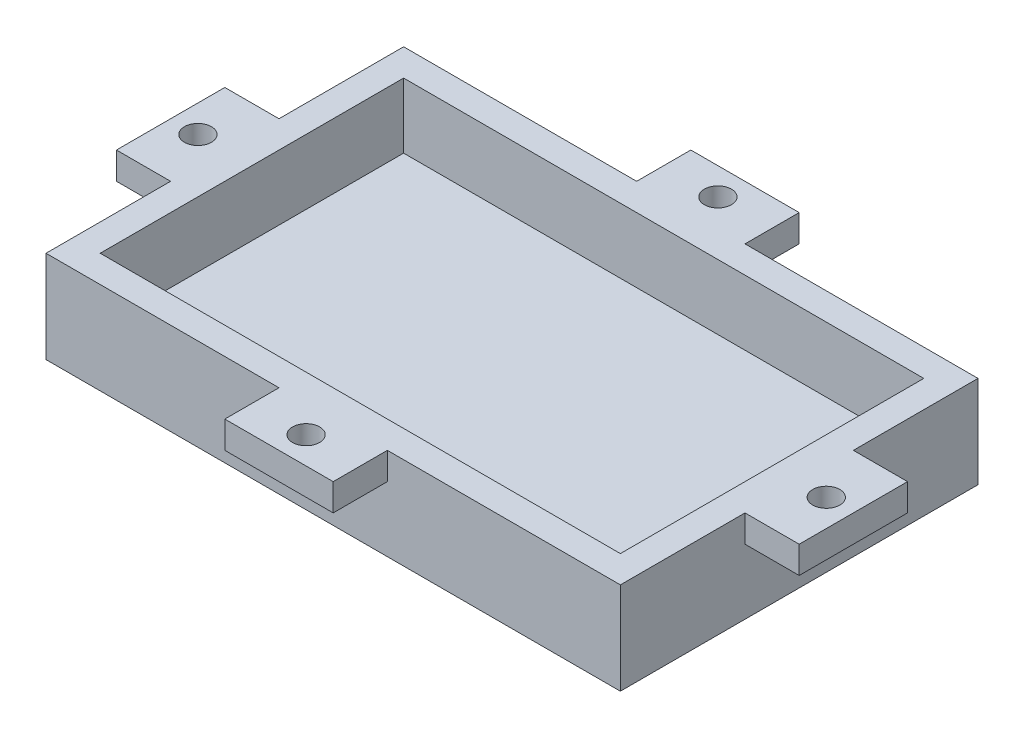
ISO-10303-21;
HEADER;
FILE_DESCRIPTION(('STEP AP214'),'2;1');
FILE_NAME('part.step','',(''),(''),'','','');
FILE_SCHEMA(('AUTOMOTIVE_DESIGN { 1 0 10303 214 1 1 1 1 }'));
ENDSEC;
DATA;
#1=APPLICATION_CONTEXT('core data for automotive mechanical design processes');
#2=APPLICATION_PROTOCOL_DEFINITION('international standard','automotive_design',2000,#1);
#3=PRODUCT_CONTEXT('',#1,'mechanical');
#4=PRODUCT('Part','Part','',(#3));
#5=PRODUCT_RELATED_PRODUCT_CATEGORY('part','',(#4));
#6=PRODUCT_DEFINITION_FORMATION('','',#4);
#7=PRODUCT_DEFINITION_CONTEXT('part definition',#1,'design');
#8=PRODUCT_DEFINITION('design','',#6,#7);
#9=PRODUCT_DEFINITION_SHAPE('','',#8);
#10=(LENGTH_UNIT() NAMED_UNIT(*) SI_UNIT(.MILLI.,.METRE.));
#11=(NAMED_UNIT(*) PLANE_ANGLE_UNIT() SI_UNIT($,.RADIAN.));
#12=(NAMED_UNIT(*) SI_UNIT($,.STERADIAN.) SOLID_ANGLE_UNIT());
#13=UNCERTAINTY_MEASURE_WITH_UNIT(LENGTH_MEASURE(1.E-05),#10,'distance_accuracy_value','');
#14=(GEOMETRIC_REPRESENTATION_CONTEXT(3) GLOBAL_UNCERTAINTY_ASSIGNED_CONTEXT((#13)) GLOBAL_UNIT_ASSIGNED_CONTEXT((#10,
#11,#12)) REPRESENTATION_CONTEXT('',''));
#15=CARTESIAN_POINT('',(0.,0.,0.));
#16=DIRECTION('',(0.,0.,1.));
#17=DIRECTION('',(1.,0.,0.));
#18=AXIS2_PLACEMENT_3D('',#15,#16,#17);
#19=CARTESIAN_POINT('',(-33.655,3.175,20.955));
#20=DIRECTION('',(0.,0.,-1.));
#21=DIRECTION('',(-1.,0.,0.));
#22=AXIS2_PLACEMENT_3D('',#19,#20,#21);
#23=PLANE('',#22);
#24=DIRECTION('',(0.,1.,0.));
#25=VECTOR('',#24,1.);
#26=CARTESIAN_POINT('',(6.34999999999999,7.62,20.955));
#27=LINE('',#26,#25);
#28=CARTESIAN_POINT('',(6.34999999999999,7.62,20.955));
#29=VERTEX_POINT('',#28);
#30=CARTESIAN_POINT('',(6.34999999999999,10.795,20.955));
#31=VERTEX_POINT('',#30);
#32=EDGE_CURVE('E465',#29,#31,#27,.T.);
#33=ORIENTED_EDGE('',*,*,#32,.F.);
#34=DIRECTION('',(1.,0.,0.));
#35=VECTOR('',#34,1.);
#36=CARTESIAN_POINT('',(-6.35000000000001,7.62,20.955));
#37=LINE('',#36,#35);
#38=CARTESIAN_POINT('',(-6.35000000000001,7.62,20.955));
#39=VERTEX_POINT('',#38);
#40=EDGE_CURVE('E236',#39,#29,#37,.T.);
#41=ORIENTED_EDGE('',*,*,#40,.F.);
#42=DIRECTION('',(0.,1.,0.));
#43=VECTOR('',#42,1.);
#44=CARTESIAN_POINT('',(-6.35000000000001,7.62,20.955));
#45=LINE('',#44,#43);
#46=CARTESIAN_POINT('',(-6.35000000000002,10.795,20.955));
#47=VERTEX_POINT('',#46);
#48=EDGE_CURVE('E217',#39,#47,#45,.T.);
#49=ORIENTED_EDGE('',*,*,#48,.T.);
#50=DIRECTION('',(1.,0.,0.));
#51=VECTOR('',#50,1.);
#52=CARTESIAN_POINT('',(-33.655,10.795,20.955));
#53=LINE('',#52,#51);
#54=CARTESIAN_POINT('',(-33.655,10.795,20.955));
#55=VERTEX_POINT('',#54);
#56=EDGE_CURVE('E234',#55,#47,#53,.T.);
#57=ORIENTED_EDGE('',*,*,#56,.F.);
#58=DIRECTION('',(0.,-1.,0.));
#59=VECTOR('',#58,1.);
#60=CARTESIAN_POINT('',(-33.655,3.175,20.955));
#61=LINE('',#60,#59);
#62=CARTESIAN_POINT('',(-33.655,0.,20.955));
#63=VERTEX_POINT('',#62);
#64=EDGE_CURVE('E441',#55,#63,#61,.T.);
#65=ORIENTED_EDGE('',*,*,#64,.T.);
#66=DIRECTION('',(1.,0.,0.));
#67=VECTOR('',#66,1.);
#68=CARTESIAN_POINT('',(-33.655,0.,20.955));
#69=LINE('',#68,#67);
#70=CARTESIAN_POINT('',(33.655,0.,20.955));
#71=VERTEX_POINT('',#70);
#72=EDGE_CURVE('E426',#63,#71,#69,.T.);
#73=ORIENTED_EDGE('',*,*,#72,.T.);
#74=DIRECTION('',(0.,-1.,0.));
#75=VECTOR('',#74,1.);
#76=CARTESIAN_POINT('',(33.655,3.175,20.955));
#77=LINE('',#76,#75);
#78=CARTESIAN_POINT('',(33.655,10.795,20.955));
#79=VERTEX_POINT('',#78);
#80=EDGE_CURVE('E12',#79,#71,#77,.T.);
#81=ORIENTED_EDGE('',*,*,#80,.F.);
#82=EDGE_CURVE('E423',#31,#79,#53,.T.);
#83=ORIENTED_EDGE('',*,*,#82,.F.);
#84=EDGE_LOOP('',(#33,#41,#49,#57,#65,#73,#81,#83));
#85=FACE_BOUND('',#84,.T.);
#86=ADVANCED_FACE('F48',(#85),#23,.F.);
#87=CARTESIAN_POINT('',(-33.655,3.175,-20.955));
#88=DIRECTION('',(1.,0.,0.));
#89=DIRECTION('',(0.,0.,-1.));
#90=AXIS2_PLACEMENT_3D('',#87,#88,#89);
#91=PLANE('',#90);
#92=DIRECTION('',(0.,1.,0.));
#93=VECTOR('',#92,1.);
#94=CARTESIAN_POINT('',(-33.655,7.62,6.35));
#95=LINE('',#94,#93);
#96=CARTESIAN_POINT('',(-33.655,7.62,6.35));
#97=VERTEX_POINT('',#96);
#98=CARTESIAN_POINT('',(-33.655,10.795,6.35));
#99=VERTEX_POINT('',#98);
#100=EDGE_CURVE('E363',#97,#99,#95,.T.);
#101=ORIENTED_EDGE('',*,*,#100,.F.);
#102=DIRECTION('',(0.,0.,1.));
#103=VECTOR('',#102,1.);
#104=CARTESIAN_POINT('',(-33.655,7.62,-6.35));
#105=LINE('',#104,#103);
#106=CARTESIAN_POINT('',(-33.655,7.62,-6.35));
#107=VERTEX_POINT('',#106);
#108=EDGE_CURVE('E339',#107,#97,#105,.T.);
#109=ORIENTED_EDGE('',*,*,#108,.F.);
#110=DIRECTION('',(0.,1.,0.));
#111=VECTOR('',#110,1.);
#112=CARTESIAN_POINT('',(-33.655,7.62,-6.35));
#113=LINE('',#112,#111);
#114=CARTESIAN_POINT('',(-33.655,10.795,-6.35));
#115=VERTEX_POINT('',#114);
#116=EDGE_CURVE('E359',#107,#115,#113,.T.);
#117=ORIENTED_EDGE('',*,*,#116,.T.);
#118=DIRECTION('',(0.,0.,1.));
#119=VECTOR('',#118,1.);
#120=CARTESIAN_POINT('',(-33.655,10.795,-20.955));
#121=LINE('',#120,#119);
#122=CARTESIAN_POINT('',(-33.655,10.795,-20.955));
#123=VERTEX_POINT('',#122);
#124=EDGE_CURVE('E419',#123,#115,#121,.T.);
#125=ORIENTED_EDGE('',*,*,#124,.F.);
#126=DIRECTION('',(0.,-1.,0.));
#127=VECTOR('',#126,1.);
#128=CARTESIAN_POINT('',(-33.655,3.175,-20.955));
#129=LINE('',#128,#127);
#130=CARTESIAN_POINT('',(-33.655,0.,-20.955));
#131=VERTEX_POINT('',#130);
#132=EDGE_CURVE('E445',#123,#131,#129,.T.);
#133=ORIENTED_EDGE('',*,*,#132,.T.);
#134=DIRECTION('',(0.,0.,1.));
#135=VECTOR('',#134,1.);
#136=CARTESIAN_POINT('',(-33.655,0.,-20.955));
#137=LINE('',#136,#135);
#138=EDGE_CURVE('E438',#131,#63,#137,.T.);
#139=ORIENTED_EDGE('',*,*,#138,.T.);
#140=ORIENTED_EDGE('',*,*,#64,.F.);
#141=EDGE_CURVE('E418',#99,#55,#121,.T.);
#142=ORIENTED_EDGE('',*,*,#141,.F.);
#143=EDGE_LOOP('',(#101,#109,#117,#125,#133,#139,#140,#142));
#144=FACE_BOUND('',#143,.T.);
#145=ADVANCED_FACE('F521',(#144),#91,.F.);
#146=CARTESIAN_POINT('',(33.655,3.175,-20.955));
#147=DIRECTION('',(1.,0.,0.));
#148=DIRECTION('',(0.,0.,-1.));
#149=AXIS2_PLACEMENT_3D('',#146,#147,#148);
#150=PLANE('',#149);
#151=DIRECTION('',(0.,1.,0.));
#152=VECTOR('',#151,1.);
#153=CARTESIAN_POINT('',(33.655,7.62,-6.34999999999999));
#154=LINE('',#153,#152);
#155=CARTESIAN_POINT('',(33.655,7.62,-6.34999999999999));
#156=VERTEX_POINT('',#155);
#157=CARTESIAN_POINT('',(33.655,10.795,-6.34999999999999));
#158=VERTEX_POINT('',#157);
#159=EDGE_CURVE('E246',#156,#158,#154,.T.);
#160=ORIENTED_EDGE('',*,*,#159,.F.);
#161=DIRECTION('',(0.,0.,1.));
#162=VECTOR('',#161,1.);
#163=CARTESIAN_POINT('',(33.655,7.62,-6.34999999999999));
#164=LINE('',#163,#162);
#165=CARTESIAN_POINT('',(33.655,7.62,6.35));
#166=VERTEX_POINT('',#165);
#167=EDGE_CURVE('E271',#156,#166,#164,.T.);
#168=ORIENTED_EDGE('',*,*,#167,.T.);
#169=DIRECTION('',(0.,1.,0.));
#170=VECTOR('',#169,1.);
#171=CARTESIAN_POINT('',(33.655,7.62,6.35));
#172=LINE('',#171,#170);
#173=CARTESIAN_POINT('',(33.655,10.795,6.35));
#174=VERTEX_POINT('',#173);
#175=EDGE_CURVE('E254',#166,#174,#172,.T.);
#176=ORIENTED_EDGE('',*,*,#175,.T.);
#177=DIRECTION('',(0.,0.,-1.));
#178=VECTOR('',#177,1.);
#179=CARTESIAN_POINT('',(33.655,10.795,-20.955));
#180=LINE('',#179,#178);
#181=EDGE_CURVE('E410',#79,#174,#180,.T.);
#182=ORIENTED_EDGE('',*,*,#181,.F.);
#183=ORIENTED_EDGE('',*,*,#80,.T.);
#184=DIRECTION('',(0.,0.,1.));
#185=VECTOR('',#184,1.);
#186=CARTESIAN_POINT('',(33.655,0.,-20.955));
#187=LINE('',#186,#185);
#188=CARTESIAN_POINT('',(33.655,0.,-20.955));
#189=VERTEX_POINT('',#188);
#190=EDGE_CURVE('E430',#189,#71,#187,.T.);
#191=ORIENTED_EDGE('',*,*,#190,.F.);
#192=DIRECTION('',(0.,-1.,0.));
#193=VECTOR('',#192,1.);
#194=CARTESIAN_POINT('',(33.655,3.175,-20.955));
#195=LINE('',#194,#193);
#196=CARTESIAN_POINT('',(33.655,10.795,-20.955));
#197=VERTEX_POINT('',#196);
#198=EDGE_CURVE('E57',#197,#189,#195,.T.);
#199=ORIENTED_EDGE('',*,*,#198,.F.);
#200=EDGE_CURVE('E409',#158,#197,#180,.T.);
#201=ORIENTED_EDGE('',*,*,#200,.F.);
#202=EDGE_LOOP('',(#160,#168,#176,#182,#183,#191,#199,#201));
#203=FACE_BOUND('',#202,.T.);
#204=ADVANCED_FACE('F526',(#203),#150,.T.);
#205=CARTESIAN_POINT('',(-33.655,3.175,-20.955));
#206=DIRECTION('',(0.,0.,-1.));
#207=DIRECTION('',(-1.,0.,0.));
#208=AXIS2_PLACEMENT_3D('',#205,#206,#207);
#209=PLANE('',#208);
#210=DIRECTION('',(0.,1.,0.));
#211=VECTOR('',#210,1.);
#212=CARTESIAN_POINT('',(-6.35,7.62,-20.955));
#213=LINE('',#212,#211);
#214=CARTESIAN_POINT('',(-6.35,7.62,-20.955));
#215=VERTEX_POINT('',#214);
#216=CARTESIAN_POINT('',(-6.35,10.795,-20.955));
#217=VERTEX_POINT('',#216);
#218=EDGE_CURVE('E297',#215,#217,#213,.T.);
#219=ORIENTED_EDGE('',*,*,#218,.F.);
#220=DIRECTION('',(1.,0.,0.));
#221=VECTOR('',#220,1.);
#222=CARTESIAN_POINT('',(-6.35,7.62,-20.955));
#223=LINE('',#222,#221);
#224=CARTESIAN_POINT('',(6.35,7.62,-20.955));
#225=VERTEX_POINT('',#224);
#226=EDGE_CURVE('E320',#215,#225,#223,.T.);
#227=ORIENTED_EDGE('',*,*,#226,.T.);
#228=DIRECTION('',(0.,1.,0.));
#229=VECTOR('',#228,1.);
#230=CARTESIAN_POINT('',(6.35,7.62,-20.955));
#231=LINE('',#230,#229);
#232=CARTESIAN_POINT('',(6.34999999999999,10.795,-20.955));
#233=VERTEX_POINT('',#232);
#234=EDGE_CURVE('E293',#225,#233,#231,.T.);
#235=ORIENTED_EDGE('',*,*,#234,.T.);
#236=DIRECTION('',(-1.,0.,0.));
#237=VECTOR('',#236,1.);
#238=CARTESIAN_POINT('',(-33.655,10.795,-20.955));
#239=LINE('',#238,#237);
#240=EDGE_CURVE('E414',#197,#233,#239,.T.);
#241=ORIENTED_EDGE('',*,*,#240,.F.);
#242=ORIENTED_EDGE('',*,*,#198,.T.);
#243=DIRECTION('',(1.,0.,0.));
#244=VECTOR('',#243,1.);
#245=CARTESIAN_POINT('',(-33.655,0.,-20.955));
#246=LINE('',#245,#244);
#247=EDGE_CURVE('E434',#131,#189,#246,.T.);
#248=ORIENTED_EDGE('',*,*,#247,.F.);
#249=ORIENTED_EDGE('',*,*,#132,.F.);
#250=EDGE_CURVE('E413',#217,#123,#239,.T.);
#251=ORIENTED_EDGE('',*,*,#250,.F.);
#252=EDGE_LOOP('',(#219,#227,#235,#241,#242,#248,#249,#251));
#253=FACE_BOUND('',#252,.T.);
#254=ADVANCED_FACE('F547',(#253),#209,.T.);
#255=CARTESIAN_POINT('',(0.,0.,0.));
#256=DIRECTION('',(0.,-1.,0.));
#257=DIRECTION('',(0.,0.,-1.));
#258=AXIS2_PLACEMENT_3D('',#255,#256,#257);
#259=PLANE('',#258);
#260=ORIENTED_EDGE('',*,*,#72,.F.);
#261=ORIENTED_EDGE('',*,*,#138,.F.);
#262=ORIENTED_EDGE('',*,*,#247,.T.);
#263=ORIENTED_EDGE('',*,*,#190,.T.);
#264=EDGE_LOOP('',(#260,#261,#262,#263));
#265=FACE_BOUND('',#264,.T.);
#266=ADVANCED_FACE('F498',(#265),#259,.T.);
#267=CARTESIAN_POINT('',(0.,10.795,0.));
#268=DIRECTION('',(0.,1.,0.));
#269=DIRECTION('',(0.,0.,1.));
#270=AXIS2_PLACEMENT_3D('',#267,#268,#269);
#271=PLANE('',#270);
#272=CARTESIAN_POINT('',(0.,10.795,24.13));
#273=DIRECTION('',(0.,1.,0.));
#274=DIRECTION('',(0.,0.,1.));
#275=AXIS2_PLACEMENT_3D('',#272,#273,#274);
#276=CIRCLE('',#275,1.5875);
#277=CARTESIAN_POINT('',(0.,10.795,25.7175));
#278=VERTEX_POINT('',#277);
#279=EDGE_CURVE('E455',#278,#278,#276,.T.);
#280=ORIENTED_EDGE('',*,*,#279,.F.);
#281=EDGE_LOOP('',(#280));
#282=FACE_BOUND('',#281,.T.);
#283=CARTESIAN_POINT('',(36.83,10.795,0.));
#284=DIRECTION('',(0.,1.,0.));
#285=DIRECTION('',(0.,0.,1.));
#286=AXIS2_PLACEMENT_3D('',#283,#284,#285);
#287=CIRCLE('',#286,1.5875);
#288=CARTESIAN_POINT('',(36.83,10.795,1.5875));
#289=VERTEX_POINT('',#288);
#290=EDGE_CURVE('E485',#289,#289,#287,.T.);
#291=ORIENTED_EDGE('',*,*,#290,.F.);
#292=EDGE_LOOP('',(#291));
#293=FACE_BOUND('',#292,.T.);
#294=CARTESIAN_POINT('',(-36.8064146648023,10.795,0.));
#295=DIRECTION('',(0.,1.,0.));
#296=DIRECTION('',(0.,0.,1.));
#297=AXIS2_PLACEMENT_3D('',#294,#295,#296);
#298=CIRCLE('',#297,1.5875);
#299=CARTESIAN_POINT('',(-36.8064146648023,10.795,1.5875));
#300=VERTEX_POINT('',#299);
#301=EDGE_CURVE('E481',#300,#300,#298,.T.);
#302=ORIENTED_EDGE('',*,*,#301,.F.);
#303=EDGE_LOOP('',(#302));
#304=FACE_BOUND('',#303,.T.);
#305=CARTESIAN_POINT('',(0.,10.795,-24.13));
#306=DIRECTION('',(0.,1.,0.));
#307=DIRECTION('',(0.,0.,1.));
#308=AXIS2_PLACEMENT_3D('',#305,#306,#307);
#309=CIRCLE('',#308,1.5875);
#310=CARTESIAN_POINT('',(0.,10.795,-22.5425));
#311=VERTEX_POINT('',#310);
#312=EDGE_CURVE('E477',#311,#311,#309,.T.);
#313=ORIENTED_EDGE('',*,*,#312,.F.);
#314=EDGE_LOOP('',(#313));
#315=FACE_BOUND('',#314,.T.);
#316=ORIENTED_EDGE('',*,*,#181,.T.);
#317=DIRECTION('',(1.,0.,0.));
#318=VECTOR('',#317,1.);
#319=CARTESIAN_POINT('',(33.655,10.795,6.35));
#320=LINE('',#319,#318);
#321=CARTESIAN_POINT('',(40.005,10.795,6.35));
#322=VERTEX_POINT('',#321);
#323=EDGE_CURVE('E73',#174,#322,#320,.T.);
#324=ORIENTED_EDGE('',*,*,#323,.T.);
#325=DIRECTION('',(0.,0.,1.));
#326=VECTOR('',#325,1.);
#327=CARTESIAN_POINT('',(40.005,10.795,-6.34999999999999));
#328=LINE('',#327,#326);
#329=CARTESIAN_POINT('',(40.005,10.795,-6.34999999999999));
#330=VERTEX_POINT('',#329);
#331=EDGE_CURVE('E270',#330,#322,#328,.T.);
#332=ORIENTED_EDGE('',*,*,#331,.F.);
#333=DIRECTION('',(1.,0.,0.));
#334=VECTOR('',#333,1.);
#335=CARTESIAN_POINT('',(33.655,10.795,-6.34999999999999));
#336=LINE('',#335,#334);
#337=EDGE_CURVE('E267',#158,#330,#336,.T.);
#338=ORIENTED_EDGE('',*,*,#337,.F.);
#339=ORIENTED_EDGE('',*,*,#200,.T.);
#340=ORIENTED_EDGE('',*,*,#240,.T.);
#341=DIRECTION('',(0.,0.,1.));
#342=VECTOR('',#341,1.);
#343=CARTESIAN_POINT('',(6.35,10.795,-27.305));
#344=LINE('',#343,#342);
#345=CARTESIAN_POINT('',(6.35,10.795,-27.305));
#346=VERTEX_POINT('',#345);
#347=EDGE_CURVE('E308',#346,#233,#344,.T.);
#348=ORIENTED_EDGE('',*,*,#347,.F.);
#349=DIRECTION('',(1.,0.,0.));
#350=VECTOR('',#349,1.);
#351=CARTESIAN_POINT('',(-6.35,10.795,-27.305));
#352=LINE('',#351,#350);
#353=CARTESIAN_POINT('',(-6.35,10.795,-27.305));
#354=VERTEX_POINT('',#353);
#355=EDGE_CURVE('E312',#354,#346,#352,.T.);
#356=ORIENTED_EDGE('',*,*,#355,.F.);
#357=DIRECTION('',(0.,0.,1.));
#358=VECTOR('',#357,1.);
#359=CARTESIAN_POINT('',(-6.35,10.795,-27.305));
#360=LINE('',#359,#358);
#361=EDGE_CURVE('E304',#354,#217,#360,.T.);
#362=ORIENTED_EDGE('',*,*,#361,.T.);
#363=ORIENTED_EDGE('',*,*,#250,.T.);
#364=ORIENTED_EDGE('',*,*,#124,.T.);
#365=DIRECTION('',(1.,0.,0.));
#366=VECTOR('',#365,1.);
#367=CARTESIAN_POINT('',(-40.005,10.795,-6.35));
#368=LINE('',#367,#366);
#369=CARTESIAN_POINT('',(-40.005,10.795,-6.35));
#370=VERTEX_POINT('',#369);
#371=EDGE_CURVE('E335',#370,#115,#368,.T.);
#372=ORIENTED_EDGE('',*,*,#371,.F.);
#373=DIRECTION('',(0.,0.,1.));
#374=VECTOR('',#373,1.);
#375=CARTESIAN_POINT('',(-40.005,10.795,-6.35));
#376=LINE('',#375,#374);
#377=CARTESIAN_POINT('',(-40.005,10.795,6.35));
#378=VERTEX_POINT('',#377);
#379=EDGE_CURVE('E316',#370,#378,#376,.T.);
#380=ORIENTED_EDGE('',*,*,#379,.T.);
#381=DIRECTION('',(1.,0.,0.));
#382=VECTOR('',#381,1.);
#383=CARTESIAN_POINT('',(-40.005,10.795,6.35));
#384=LINE('',#383,#382);
#385=EDGE_CURVE('E349',#378,#99,#384,.T.);
#386=ORIENTED_EDGE('',*,*,#385,.T.);
#387=ORIENTED_EDGE('',*,*,#141,.T.);
#388=ORIENTED_EDGE('',*,*,#56,.T.);
#389=DIRECTION('',(0.,0.,1.));
#390=VECTOR('',#389,1.);
#391=CARTESIAN_POINT('',(-6.35000000000001,10.795,20.955));
#392=LINE('',#391,#390);
#393=CARTESIAN_POINT('',(-6.35,10.795,27.305));
#394=VERTEX_POINT('',#393);
#395=EDGE_CURVE('E65',#47,#394,#392,.T.);
#396=ORIENTED_EDGE('',*,*,#395,.T.);
#397=DIRECTION('',(1.,0.,0.));
#398=VECTOR('',#397,1.);
#399=CARTESIAN_POINT('',(-6.35,10.795,27.305));
#400=LINE('',#399,#398);
#401=CARTESIAN_POINT('',(6.34999999999999,10.795,27.305));
#402=VERTEX_POINT('',#401);
#403=EDGE_CURVE('E221',#394,#402,#400,.T.);
#404=ORIENTED_EDGE('',*,*,#403,.T.);
#405=DIRECTION('',(0.,0.,1.));
#406=VECTOR('',#405,1.);
#407=CARTESIAN_POINT('',(6.34999999999999,10.795,20.955));
#408=LINE('',#407,#406);
#409=EDGE_CURVE('E227',#31,#402,#408,.T.);
#410=ORIENTED_EDGE('',*,*,#409,.F.);
#411=ORIENTED_EDGE('',*,*,#82,.T.);
#412=EDGE_LOOP('',(#316,#324,#332,#338,#339,#340,#348,#356,#362,#363,#364,#372,#380,#386,#387,
#388,#396,#404,#410,#411));
#413=FACE_BOUND('',#412,.T.);
#414=DIRECTION('',(-1.,0.,0.));
#415=VECTOR('',#414,1.);
#416=CARTESIAN_POINT('',(-30.48,10.795,-17.78));
#417=LINE('',#416,#415);
#418=CARTESIAN_POINT('',(30.48,10.795,-17.78));
#419=VERTEX_POINT('',#418);
#420=CARTESIAN_POINT('',(-30.48,10.795,-17.78));
#421=VERTEX_POINT('',#420);
#422=EDGE_CURVE('E371',#419,#421,#417,.T.);
#423=ORIENTED_EDGE('',*,*,#422,.F.);
#424=DIRECTION('',(0.,0.,-1.));
#425=VECTOR('',#424,1.);
#426=CARTESIAN_POINT('',(30.48,10.795,-17.78));
#427=LINE('',#426,#425);
#428=CARTESIAN_POINT('',(30.48,10.795,17.78));
#429=VERTEX_POINT('',#428);
#430=EDGE_CURVE('E368',#429,#419,#427,.T.);
#431=ORIENTED_EDGE('',*,*,#430,.F.);
#432=DIRECTION('',(1.,0.,0.));
#433=VECTOR('',#432,1.);
#434=CARTESIAN_POINT('',(-30.48,10.795,17.78));
#435=LINE('',#434,#433);
#436=CARTESIAN_POINT('',(-30.48,10.795,17.78));
#437=VERTEX_POINT('',#436);
#438=EDGE_CURVE('E379',#437,#429,#435,.T.);
#439=ORIENTED_EDGE('',*,*,#438,.F.);
#440=DIRECTION('',(0.,0.,1.));
#441=VECTOR('',#440,1.);
#442=CARTESIAN_POINT('',(-30.48,10.795,-17.78));
#443=LINE('',#442,#441);
#444=EDGE_CURVE('E375',#421,#437,#443,.T.);
#445=ORIENTED_EDGE('',*,*,#444,.F.);
#446=EDGE_LOOP('',(#423,#431,#439,#445));
#447=FACE_BOUND('',#446,.T.);
#448=ADVANCED_FACE('F231',(#282,#293,#304,#315,#413,#447),#271,.T.);
#449=CARTESIAN_POINT('',(30.48,10.795,-17.78));
#450=DIRECTION('',(-1.,0.,0.));
#451=DIRECTION('',(0.,0.,1.));
#452=AXIS2_PLACEMENT_3D('',#449,#450,#451);
#453=PLANE('',#452);
#454=DIRECTION('',(0.,0.,-1.));
#455=VECTOR('',#454,1.);
#456=CARTESIAN_POINT('',(30.48,3.175,-17.78));
#457=LINE('',#456,#455);
#458=CARTESIAN_POINT('',(30.48,3.175,17.78));
#459=VERTEX_POINT('',#458);
#460=CARTESIAN_POINT('',(30.48,3.175,-17.78));
#461=VERTEX_POINT('',#460);
#462=EDGE_CURVE('E358',#459,#461,#457,.T.);
#463=ORIENTED_EDGE('',*,*,#462,.F.);
#464=DIRECTION('',(0.,-1.,0.));
#465=VECTOR('',#464,1.);
#466=CARTESIAN_POINT('',(30.48,10.795,17.78));
#467=LINE('',#466,#465);
#468=EDGE_CURVE('E382',#429,#459,#467,.T.);
#469=ORIENTED_EDGE('',*,*,#468,.F.);
#470=ORIENTED_EDGE('',*,*,#430,.T.);
#471=DIRECTION('',(0.,-1.,0.));
#472=VECTOR('',#471,1.);
#473=CARTESIAN_POINT('',(30.48,10.795,-17.78));
#474=LINE('',#473,#472);
#475=EDGE_CURVE('E405',#419,#461,#474,.T.);
#476=ORIENTED_EDGE('',*,*,#475,.T.);
#477=EDGE_LOOP('',(#463,#469,#470,#476));
#478=FACE_BOUND('',#477,.T.);
#479=ADVANCED_FACE('F497',(#478),#453,.T.);
#480=CARTESIAN_POINT('',(-30.48,10.795,-17.78));
#481=DIRECTION('',(0.,0.,1.));
#482=DIRECTION('',(1.,0.,0.));
#483=AXIS2_PLACEMENT_3D('',#480,#481,#482);
#484=PLANE('',#483);
#485=DIRECTION('',(-1.,0.,0.));
#486=VECTOR('',#485,1.);
#487=CARTESIAN_POINT('',(-30.48,3.175,-17.78));
#488=LINE('',#487,#486);
#489=CARTESIAN_POINT('',(-30.48,3.175,-17.78));
#490=VERTEX_POINT('',#489);
#491=EDGE_CURVE('E386',#461,#490,#488,.T.);
#492=ORIENTED_EDGE('',*,*,#491,.F.);
#493=ORIENTED_EDGE('',*,*,#475,.F.);
#494=ORIENTED_EDGE('',*,*,#422,.T.);
#495=DIRECTION('',(0.,-1.,0.));
#496=VECTOR('',#495,1.);
#497=CARTESIAN_POINT('',(-30.48,10.795,-17.78));
#498=LINE('',#497,#496);
#499=EDGE_CURVE('E402',#421,#490,#498,.T.);
#500=ORIENTED_EDGE('',*,*,#499,.T.);
#501=EDGE_LOOP('',(#492,#493,#494,#500));
#502=FACE_BOUND('',#501,.T.);
#503=ADVANCED_FACE('F638',(#502),#484,.T.);
#504=CARTESIAN_POINT('',(-30.48,10.795,-17.78));
#505=DIRECTION('',(1.,0.,0.));
#506=DIRECTION('',(0.,0.,-1.));
#507=AXIS2_PLACEMENT_3D('',#504,#505,#506);
#508=PLANE('',#507);
#509=DIRECTION('',(0.,0.,1.));
#510=VECTOR('',#509,1.);
#511=CARTESIAN_POINT('',(-30.48,3.175,-17.78));
#512=LINE('',#511,#510);
#513=CARTESIAN_POINT('',(-30.48,3.175,17.78));
#514=VERTEX_POINT('',#513);
#515=EDGE_CURVE('E390',#490,#514,#512,.T.);
#516=ORIENTED_EDGE('',*,*,#515,.F.);
#517=ORIENTED_EDGE('',*,*,#499,.F.);
#518=ORIENTED_EDGE('',*,*,#444,.T.);
#519=DIRECTION('',(0.,-1.,0.));
#520=VECTOR('',#519,1.);
#521=CARTESIAN_POINT('',(-30.48,10.795,17.78));
#522=LINE('',#521,#520);
#523=EDGE_CURVE('E399',#437,#514,#522,.T.);
#524=ORIENTED_EDGE('',*,*,#523,.T.);
#525=EDGE_LOOP('',(#516,#517,#518,#524));
#526=FACE_BOUND('',#525,.T.);
#527=ADVANCED_FACE('F634',(#526),#508,.T.);
#528=CARTESIAN_POINT('',(-30.48,10.795,17.78));
#529=DIRECTION('',(0.,0.,-1.));
#530=DIRECTION('',(-1.,0.,0.));
#531=AXIS2_PLACEMENT_3D('',#528,#529,#530);
#532=PLANE('',#531);
#533=DIRECTION('',(1.,0.,0.));
#534=VECTOR('',#533,1.);
#535=CARTESIAN_POINT('',(-30.48,3.175,17.78));
#536=LINE('',#535,#534);
#537=EDGE_CURVE('E372',#514,#459,#536,.T.);
#538=ORIENTED_EDGE('',*,*,#537,.F.);
#539=ORIENTED_EDGE('',*,*,#523,.F.);
#540=ORIENTED_EDGE('',*,*,#438,.T.);
#541=ORIENTED_EDGE('',*,*,#468,.T.);
#542=EDGE_LOOP('',(#538,#539,#540,#541));
#543=FACE_BOUND('',#542,.T.);
#544=ADVANCED_FACE('F631',(#543),#532,.T.);
#545=CARTESIAN_POINT('',(0.,3.175,0.));
#546=DIRECTION('',(0.,-1.,0.));
#547=DIRECTION('',(0.,0.,-1.));
#548=AXIS2_PLACEMENT_3D('',#545,#546,#547);
#549=PLANE('',#548);
#550=ORIENTED_EDGE('',*,*,#537,.T.);
#551=ORIENTED_EDGE('',*,*,#462,.T.);
#552=ORIENTED_EDGE('',*,*,#491,.T.);
#553=ORIENTED_EDGE('',*,*,#515,.T.);
#554=EDGE_LOOP('',(#550,#551,#552,#553));
#555=FACE_BOUND('',#554,.T.);
#556=ADVANCED_FACE('F630',(#555),#549,.F.);
#557=CARTESIAN_POINT('',(-40.005,7.62,-6.35));
#558=DIRECTION('',(-1.,0.,0.));
#559=DIRECTION('',(0.,0.,1.));
#560=AXIS2_PLACEMENT_3D('',#557,#558,#559);
#561=PLANE('',#560);
#562=ORIENTED_EDGE('',*,*,#379,.F.);
#563=DIRECTION('',(0.,1.,0.));
#564=VECTOR('',#563,1.);
#565=CARTESIAN_POINT('',(-40.005,7.62,-6.35));
#566=LINE('',#565,#564);
#567=CARTESIAN_POINT('',(-40.005,7.62,-6.35));
#568=VERTEX_POINT('',#567);
#569=EDGE_CURVE('E355',#568,#370,#566,.T.);
#570=ORIENTED_EDGE('',*,*,#569,.F.);
#571=DIRECTION('',(0.,0.,1.));
#572=VECTOR('',#571,1.);
#573=CARTESIAN_POINT('',(-40.005,7.62,-6.35));
#574=LINE('',#573,#572);
#575=CARTESIAN_POINT('',(-40.005,7.62,6.35));
#576=VERTEX_POINT('',#575);
#577=EDGE_CURVE('E330',#568,#576,#574,.T.);
#578=ORIENTED_EDGE('',*,*,#577,.T.);
#579=DIRECTION('',(0.,1.,0.));
#580=VECTOR('',#579,1.);
#581=CARTESIAN_POINT('',(-40.005,7.62,6.35));
#582=LINE('',#581,#580);
#583=EDGE_CURVE('E345',#576,#378,#582,.T.);
#584=ORIENTED_EDGE('',*,*,#583,.T.);
#585=EDGE_LOOP('',(#562,#570,#578,#584));
#586=FACE_BOUND('',#585,.T.);
#587=ADVANCED_FACE('F573',(#586),#561,.T.);
#588=CARTESIAN_POINT('',(-40.005,7.62,-6.35));
#589=DIRECTION('',(0.,0.,1.));
#590=DIRECTION('',(1.,0.,0.));
#591=AXIS2_PLACEMENT_3D('',#588,#589,#590);
#592=PLANE('',#591);
#593=ORIENTED_EDGE('',*,*,#371,.T.);
#594=ORIENTED_EDGE('',*,*,#116,.F.);
#595=DIRECTION('',(1.,0.,0.));
#596=VECTOR('',#595,1.);
#597=CARTESIAN_POINT('',(-40.005,7.62,-6.35));
#598=LINE('',#597,#596);
#599=EDGE_CURVE('E342',#568,#107,#598,.T.);
#600=ORIENTED_EDGE('',*,*,#599,.F.);
#601=ORIENTED_EDGE('',*,*,#569,.T.);
#602=EDGE_LOOP('',(#593,#594,#600,#601));
#603=FACE_BOUND('',#602,.T.);
#604=ADVANCED_FACE('F570',(#603),#592,.F.);
#605=CARTESIAN_POINT('',(-40.005,7.62,6.35));
#606=DIRECTION('',(0.,0.,1.));
#607=DIRECTION('',(1.,0.,0.));
#608=AXIS2_PLACEMENT_3D('',#605,#606,#607);
#609=PLANE('',#608);
#610=ORIENTED_EDGE('',*,*,#385,.F.);
#611=ORIENTED_EDGE('',*,*,#583,.F.);
#612=DIRECTION('',(1.,0.,0.));
#613=VECTOR('',#612,1.);
#614=CARTESIAN_POINT('',(-40.005,7.62,6.35));
#615=LINE('',#614,#613);
#616=EDGE_CURVE('E334',#576,#97,#615,.T.);
#617=ORIENTED_EDGE('',*,*,#616,.T.);
#618=ORIENTED_EDGE('',*,*,#100,.T.);
#619=EDGE_LOOP('',(#610,#611,#617,#618));
#620=FACE_BOUND('',#619,.T.);
#621=ADVANCED_FACE('F623',(#620),#609,.T.);
#622=CARTESIAN_POINT('',(0.,7.62,0.));
#623=DIRECTION('',(0.,1.,0.));
#624=DIRECTION('',(0.,0.,1.));
#625=AXIS2_PLACEMENT_3D('',#622,#623,#624);
#626=PLANE('',#625);
#627=CARTESIAN_POINT('',(-36.8064146648023,7.62,0.));
#628=DIRECTION('',(0.,1.,0.));
#629=DIRECTION('',(0.,0.,1.));
#630=AXIS2_PLACEMENT_3D('',#627,#628,#629);
#631=CIRCLE('',#630,1.5875);
#632=CARTESIAN_POINT('',(-36.8064146648023,7.62,1.5875));
#633=VERTEX_POINT('',#632);
#634=EDGE_CURVE('E51',#633,#633,#631,.T.);
#635=ORIENTED_EDGE('',*,*,#634,.T.);
#636=EDGE_LOOP('',(#635));
#637=FACE_BOUND('',#636,.T.);
#638=ORIENTED_EDGE('',*,*,#577,.F.);
#639=ORIENTED_EDGE('',*,*,#599,.T.);
#640=ORIENTED_EDGE('',*,*,#108,.T.);
#641=ORIENTED_EDGE('',*,*,#616,.F.);
#642=EDGE_LOOP('',(#638,#639,#640,#641));
#643=FACE_BOUND('',#642,.T.);
#644=ADVANCED_FACE('F613',(#637,#643),#626,.F.);
#645=CARTESIAN_POINT('',(-6.35,7.62,-27.305));
#646=DIRECTION('',(0.,0.,1.));
#647=DIRECTION('',(1.,0.,0.));
#648=AXIS2_PLACEMENT_3D('',#645,#646,#647);
#649=PLANE('',#648);
#650=ORIENTED_EDGE('',*,*,#355,.T.);
#651=DIRECTION('',(0.,1.,0.));
#652=VECTOR('',#651,1.);
#653=CARTESIAN_POINT('',(6.35,7.62,-27.305));
#654=LINE('',#653,#652);
#655=CARTESIAN_POINT('',(6.35,7.62,-27.305));
#656=VERTEX_POINT('',#655);
#657=EDGE_CURVE('E277',#656,#346,#654,.T.);
#658=ORIENTED_EDGE('',*,*,#657,.F.);
#659=DIRECTION('',(1.,0.,0.));
#660=VECTOR('',#659,1.);
#661=CARTESIAN_POINT('',(-6.35,7.62,-27.305));
#662=LINE('',#661,#660);
#663=CARTESIAN_POINT('',(-6.35,7.62,-27.305));
#664=VERTEX_POINT('',#663);
#665=EDGE_CURVE('E309',#664,#656,#662,.T.);
#666=ORIENTED_EDGE('',*,*,#665,.F.);
#667=DIRECTION('',(0.,1.,0.));
#668=VECTOR('',#667,1.);
#669=CARTESIAN_POINT('',(-6.35,7.62,-27.305));
#670=LINE('',#669,#668);
#671=EDGE_CURVE('E300',#664,#354,#670,.T.);
#672=ORIENTED_EDGE('',*,*,#671,.T.);
#673=EDGE_LOOP('',(#650,#658,#666,#672));
#674=FACE_BOUND('',#673,.T.);
#675=ADVANCED_FACE('F610',(#674),#649,.F.);
#676=CARTESIAN_POINT('',(6.35,7.62,-27.305));
#677=DIRECTION('',(-1.,0.,0.));
#678=DIRECTION('',(0.,0.,1.));
#679=AXIS2_PLACEMENT_3D('',#676,#677,#678);
#680=PLANE('',#679);
#681=ORIENTED_EDGE('',*,*,#347,.T.);
#682=ORIENTED_EDGE('',*,*,#234,.F.);
#683=DIRECTION('',(0.,0.,1.));
#684=VECTOR('',#683,1.);
#685=CARTESIAN_POINT('',(6.35,7.62,-27.305));
#686=LINE('',#685,#684);
#687=EDGE_CURVE('E324',#656,#225,#686,.T.);
#688=ORIENTED_EDGE('',*,*,#687,.F.);
#689=ORIENTED_EDGE('',*,*,#657,.T.);
#690=EDGE_LOOP('',(#681,#682,#688,#689));
#691=FACE_BOUND('',#690,.T.);
#692=ADVANCED_FACE('F550',(#691),#680,.F.);
#693=CARTESIAN_POINT('',(-6.35,7.62,-27.305));
#694=DIRECTION('',(-1.,0.,0.));
#695=DIRECTION('',(0.,0.,1.));
#696=AXIS2_PLACEMENT_3D('',#693,#694,#695);
#697=PLANE('',#696);
#698=ORIENTED_EDGE('',*,*,#361,.F.);
#699=ORIENTED_EDGE('',*,*,#671,.F.);
#700=DIRECTION('',(0.,0.,1.));
#701=VECTOR('',#700,1.);
#702=CARTESIAN_POINT('',(-6.35,7.62,-27.305));
#703=LINE('',#702,#701);
#704=EDGE_CURVE('E303',#664,#215,#703,.T.);
#705=ORIENTED_EDGE('',*,*,#704,.T.);
#706=ORIENTED_EDGE('',*,*,#218,.T.);
#707=EDGE_LOOP('',(#698,#699,#705,#706));
#708=FACE_BOUND('',#707,.T.);
#709=ADVANCED_FACE('F557',(#708),#697,.T.);
#710=CARTESIAN_POINT('',(0.,7.62,0.));
#711=DIRECTION('',(0.,-1.,0.));
#712=DIRECTION('',(0.,0.,-1.));
#713=AXIS2_PLACEMENT_3D('',#710,#711,#712);
#714=PLANE('',#713);
#715=CARTESIAN_POINT('',(0.,7.62,-24.13));
#716=DIRECTION('',(0.,-1.,0.));
#717=DIRECTION('',(0.,0.,-1.));
#718=AXIS2_PLACEMENT_3D('',#715,#716,#717);
#719=CIRCLE('',#718,1.5875);
#720=CARTESIAN_POINT('',(0.,7.62,-25.7175));
#721=VERTEX_POINT('',#720);
#722=EDGE_CURVE('E458',#721,#721,#719,.T.);
#723=ORIENTED_EDGE('',*,*,#722,.F.);
#724=EDGE_LOOP('',(#723));
#725=FACE_BOUND('',#724,.T.);
#726=ORIENTED_EDGE('',*,*,#665,.T.);
#727=ORIENTED_EDGE('',*,*,#687,.T.);
#728=ORIENTED_EDGE('',*,*,#226,.F.);
#729=ORIENTED_EDGE('',*,*,#704,.F.);
#730=EDGE_LOOP('',(#726,#727,#728,#729));
#731=FACE_BOUND('',#730,.T.);
#732=ADVANCED_FACE('F607',(#725,#731),#714,.T.);
#733=CARTESIAN_POINT('',(33.655,7.62,-6.34999999999999));
#734=DIRECTION('',(0.,0.,1.));
#735=DIRECTION('',(1.,0.,0.));
#736=AXIS2_PLACEMENT_3D('',#733,#734,#735);
#737=PLANE('',#736);
#738=ORIENTED_EDGE('',*,*,#337,.T.);
#739=DIRECTION('',(0.,1.,0.));
#740=VECTOR('',#739,1.);
#741=CARTESIAN_POINT('',(40.005,7.62,-6.34999999999999));
#742=LINE('',#741,#740);
#743=CARTESIAN_POINT('',(40.005,7.62,-6.34999999999999));
#744=VERTEX_POINT('',#743);
#745=EDGE_CURVE('E261',#744,#330,#742,.T.);
#746=ORIENTED_EDGE('',*,*,#745,.F.);
#747=DIRECTION('',(1.,0.,0.));
#748=VECTOR('',#747,1.);
#749=CARTESIAN_POINT('',(33.655,7.62,-6.34999999999999));
#750=LINE('',#749,#748);
#751=EDGE_CURVE('E257',#156,#744,#750,.T.);
#752=ORIENTED_EDGE('',*,*,#751,.F.);
#753=ORIENTED_EDGE('',*,*,#159,.T.);
#754=EDGE_LOOP('',(#738,#746,#752,#753));
#755=FACE_BOUND('',#754,.T.);
#756=ADVANCED_FACE('F604',(#755),#737,.F.);
#757=CARTESIAN_POINT('',(40.005,7.62,-6.34999999999999));
#758=DIRECTION('',(-1.,0.,0.));
#759=DIRECTION('',(0.,0.,1.));
#760=AXIS2_PLACEMENT_3D('',#757,#758,#759);
#761=PLANE('',#760);
#762=ORIENTED_EDGE('',*,*,#331,.T.);
#763=DIRECTION('',(0.,1.,0.));
#764=VECTOR('',#763,1.);
#765=CARTESIAN_POINT('',(40.005,7.62,6.35));
#766=LINE('',#765,#764);
#767=CARTESIAN_POINT('',(40.005,7.62,6.35));
#768=VERTEX_POINT('',#767);
#769=EDGE_CURVE('E258',#768,#322,#766,.T.);
#770=ORIENTED_EDGE('',*,*,#769,.F.);
#771=DIRECTION('',(0.,0.,1.));
#772=VECTOR('',#771,1.);
#773=CARTESIAN_POINT('',(40.005,7.62,-6.34999999999999));
#774=LINE('',#773,#772);
#775=EDGE_CURVE('E280',#744,#768,#774,.T.);
#776=ORIENTED_EDGE('',*,*,#775,.F.);
#777=ORIENTED_EDGE('',*,*,#745,.T.);
#778=EDGE_LOOP('',(#762,#770,#776,#777));
#779=FACE_BOUND('',#778,.T.);
#780=ADVANCED_FACE('F601',(#779),#761,.F.);
#781=CARTESIAN_POINT('',(33.655,7.62,6.35));
#782=DIRECTION('',(0.,0.,1.));
#783=DIRECTION('',(1.,0.,0.));
#784=AXIS2_PLACEMENT_3D('',#781,#782,#783);
#785=PLANE('',#784);
#786=ORIENTED_EDGE('',*,*,#323,.F.);
#787=ORIENTED_EDGE('',*,*,#175,.F.);
#788=DIRECTION('',(1.,0.,0.));
#789=VECTOR('',#788,1.);
#790=CARTESIAN_POINT('',(33.655,7.62,6.35));
#791=LINE('',#790,#789);
#792=EDGE_CURVE('E283',#166,#768,#791,.T.);
#793=ORIENTED_EDGE('',*,*,#792,.T.);
#794=ORIENTED_EDGE('',*,*,#769,.T.);
#795=EDGE_LOOP('',(#786,#787,#793,#794));
#796=FACE_BOUND('',#795,.T.);
#797=ADVANCED_FACE('F590',(#796),#785,.T.);
#798=CARTESIAN_POINT('',(0.,7.62,0.));
#799=DIRECTION('',(0.,1.,0.));
#800=DIRECTION('',(0.,0.,1.));
#801=AXIS2_PLACEMENT_3D('',#798,#799,#800);
#802=PLANE('',#801);
#803=CARTESIAN_POINT('',(36.83,7.62,0.));
#804=DIRECTION('',(0.,1.,0.));
#805=DIRECTION('',(0.,0.,1.));
#806=AXIS2_PLACEMENT_3D('',#803,#804,#805);
#807=CIRCLE('',#806,1.5875);
#808=CARTESIAN_POINT('',(36.83,7.62,1.5875));
#809=VERTEX_POINT('',#808);
#810=EDGE_CURVE('E454',#809,#809,#807,.T.);
#811=ORIENTED_EDGE('',*,*,#810,.T.);
#812=EDGE_LOOP('',(#811));
#813=FACE_BOUND('',#812,.T.);
#814=ORIENTED_EDGE('',*,*,#167,.F.);
#815=ORIENTED_EDGE('',*,*,#751,.T.);
#816=ORIENTED_EDGE('',*,*,#775,.T.);
#817=ORIENTED_EDGE('',*,*,#792,.F.);
#818=EDGE_LOOP('',(#814,#815,#816,#817));
#819=FACE_BOUND('',#818,.T.);
#820=ADVANCED_FACE('F584',(#813,#819),#802,.F.);
#821=CARTESIAN_POINT('',(6.34999999999999,7.62,20.955));
#822=DIRECTION('',(-1.,0.,0.));
#823=DIRECTION('',(0.,0.,1.));
#824=AXIS2_PLACEMENT_3D('',#821,#822,#823);
#825=PLANE('',#824);
#826=ORIENTED_EDGE('',*,*,#409,.T.);
#827=DIRECTION('',(0.,1.,0.));
#828=VECTOR('',#827,1.);
#829=CARTESIAN_POINT('',(6.34999999999999,7.62,27.305));
#830=LINE('',#829,#828);
#831=CARTESIAN_POINT('',(6.34999999999999,7.62,27.305));
#832=VERTEX_POINT('',#831);
#833=EDGE_CURVE('E218',#832,#402,#830,.T.);
#834=ORIENTED_EDGE('',*,*,#833,.F.);
#835=DIRECTION('',(0.,0.,1.));
#836=VECTOR('',#835,1.);
#837=CARTESIAN_POINT('',(6.34999999999999,7.62,20.955));
#838=LINE('',#837,#836);
#839=EDGE_CURVE('E240',#29,#832,#838,.T.);
#840=ORIENTED_EDGE('',*,*,#839,.F.);
#841=ORIENTED_EDGE('',*,*,#32,.T.);
#842=EDGE_LOOP('',(#826,#834,#840,#841));
#843=FACE_BOUND('',#842,.T.);
#844=ADVANCED_FACE('F582',(#843),#825,.F.);
#845=CARTESIAN_POINT('',(-6.35,7.62,27.305));
#846=DIRECTION('',(0.,0.,1.));
#847=DIRECTION('',(1.,0.,0.));
#848=AXIS2_PLACEMENT_3D('',#845,#846,#847);
#849=PLANE('',#848);
#850=ORIENTED_EDGE('',*,*,#403,.F.);
#851=DIRECTION('',(0.,1.,0.));
#852=VECTOR('',#851,1.);
#853=CARTESIAN_POINT('',(-6.35,7.62,27.305));
#854=LINE('',#853,#852);
#855=CARTESIAN_POINT('',(-6.35,7.62,27.305));
#856=VERTEX_POINT('',#855);
#857=EDGE_CURVE('E208',#856,#394,#854,.T.);
#858=ORIENTED_EDGE('',*,*,#857,.F.);
#859=DIRECTION('',(1.,0.,0.));
#860=VECTOR('',#859,1.);
#861=CARTESIAN_POINT('',(-6.35,7.62,27.305));
#862=LINE('',#861,#860);
#863=EDGE_CURVE('E249',#856,#832,#862,.T.);
#864=ORIENTED_EDGE('',*,*,#863,.T.);
#865=ORIENTED_EDGE('',*,*,#833,.T.);
#866=EDGE_LOOP('',(#850,#858,#864,#865));
#867=FACE_BOUND('',#866,.T.);
#868=ADVANCED_FACE('F222',(#867),#849,.T.);
#869=CARTESIAN_POINT('',(-6.35000000000001,7.62,20.955));
#870=DIRECTION('',(-1.,0.,0.));
#871=DIRECTION('',(0.,0.,1.));
#872=AXIS2_PLACEMENT_3D('',#869,#870,#871);
#873=PLANE('',#872);
#874=ORIENTED_EDGE('',*,*,#395,.F.);
#875=ORIENTED_EDGE('',*,*,#48,.F.);
#876=DIRECTION('',(0.,0.,1.));
#877=VECTOR('',#876,1.);
#878=CARTESIAN_POINT('',(-6.35000000000001,7.62,20.955));
#879=LINE('',#878,#877);
#880=EDGE_CURVE('E212',#39,#856,#879,.T.);
#881=ORIENTED_EDGE('',*,*,#880,.T.);
#882=ORIENTED_EDGE('',*,*,#857,.T.);
#883=EDGE_LOOP('',(#874,#875,#881,#882));
#884=FACE_BOUND('',#883,.T.);
#885=ADVANCED_FACE('F210',(#884),#873,.T.);
#886=CARTESIAN_POINT('',(0.,7.62,0.));
#887=DIRECTION('',(0.,-1.,0.));
#888=DIRECTION('',(0.,0.,-1.));
#889=AXIS2_PLACEMENT_3D('',#886,#887,#888);
#890=PLANE('',#889);
#891=CARTESIAN_POINT('',(0.,7.62,24.13));
#892=DIRECTION('',(0.,-1.,0.));
#893=DIRECTION('',(0.,0.,-1.));
#894=AXIS2_PLACEMENT_3D('',#891,#892,#893);
#895=CIRCLE('',#894,1.5875);
#896=CARTESIAN_POINT('',(0.,7.62,22.5425));
#897=VERTEX_POINT('',#896);
#898=EDGE_CURVE('E450',#897,#897,#895,.T.);
#899=ORIENTED_EDGE('',*,*,#898,.F.);
#900=EDGE_LOOP('',(#899));
#901=FACE_BOUND('',#900,.T.);
#902=ORIENTED_EDGE('',*,*,#40,.T.);
#903=ORIENTED_EDGE('',*,*,#839,.T.);
#904=ORIENTED_EDGE('',*,*,#863,.F.);
#905=ORIENTED_EDGE('',*,*,#880,.F.);
#906=EDGE_LOOP('',(#902,#903,#904,#905));
#907=FACE_BOUND('',#906,.T.);
#908=ADVANCED_FACE('F581',(#901,#907),#890,.T.);
#909=CARTESIAN_POINT('',(0.,0.,24.13));
#910=DIRECTION('',(0.,1.,0.));
#911=DIRECTION('',(0.,0.,1.));
#912=AXIS2_PLACEMENT_3D('',#909,#910,#911);
#913=CYLINDRICAL_SURFACE('',#912,1.5875);
#914=ORIENTED_EDGE('',*,*,#898,.T.);
#915=EDGE_LOOP('',(#914));
#916=FACE_BOUND('',#915,.T.);
#917=ORIENTED_EDGE('',*,*,#279,.T.);
#918=EDGE_LOOP('',(#917));
#919=FACE_BOUND('',#918,.T.);
#920=ADVANCED_FACE('F493',(#916,#919),#913,.F.);
#921=CARTESIAN_POINT('',(36.83,0.,0.));
#922=DIRECTION('',(0.,1.,0.));
#923=DIRECTION('',(0.,0.,1.));
#924=AXIS2_PLACEMENT_3D('',#921,#922,#923);
#925=CYLINDRICAL_SURFACE('',#924,1.5875);
#926=ORIENTED_EDGE('',*,*,#290,.T.);
#927=EDGE_LOOP('',(#926));
#928=FACE_BOUND('',#927,.T.);
#929=ORIENTED_EDGE('',*,*,#810,.F.);
#930=EDGE_LOOP('',(#929));
#931=FACE_BOUND('',#930,.T.);
#932=ADVANCED_FACE('F509',(#928,#931),#925,.F.);
#933=CARTESIAN_POINT('',(0.,0.,-24.13));
#934=DIRECTION('',(0.,1.,0.));
#935=DIRECTION('',(0.,0.,1.));
#936=AXIS2_PLACEMENT_3D('',#933,#934,#935);
#937=CYLINDRICAL_SURFACE('',#936,1.5875);
#938=ORIENTED_EDGE('',*,*,#722,.T.);
#939=EDGE_LOOP('',(#938));
#940=FACE_BOUND('',#939,.T.);
#941=ORIENTED_EDGE('',*,*,#312,.T.);
#942=EDGE_LOOP('',(#941));
#943=FACE_BOUND('',#942,.T.);
#944=ADVANCED_FACE('F506',(#940,#943),#937,.F.);
#945=CARTESIAN_POINT('',(-36.8064146648023,0.,0.));
#946=DIRECTION('',(0.,1.,0.));
#947=DIRECTION('',(0.,0.,1.));
#948=AXIS2_PLACEMENT_3D('',#945,#946,#947);
#949=CYLINDRICAL_SURFACE('',#948,1.5875);
#950=ORIENTED_EDGE('',*,*,#301,.T.);
#951=EDGE_LOOP('',(#950));
#952=FACE_BOUND('',#951,.T.);
#953=ORIENTED_EDGE('',*,*,#634,.F.);
#954=EDGE_LOOP('',(#953));
#955=FACE_BOUND('',#954,.T.);
#956=ADVANCED_FACE('F508',(#952,#955),#949,.F.);
#957=CLOSED_SHELL('',(#86,#145,#204,#254,#266,#448,#479,#503,#527,#544,#556,#587,#604,#621,#644,
#675,#692,#709,#732,#756,#780,#797,#820,#844,#868,#885,#908,#920,#932,#944,#956));
#958=MANIFOLD_SOLID_BREP('B2',#957);
#959=ADVANCED_BREP_SHAPE_REPRESENTATION('',(#18,#958),#14);
#960=SHAPE_DEFINITION_REPRESENTATION(#9,#959);
ENDSEC;
END-ISO-10303-21;
